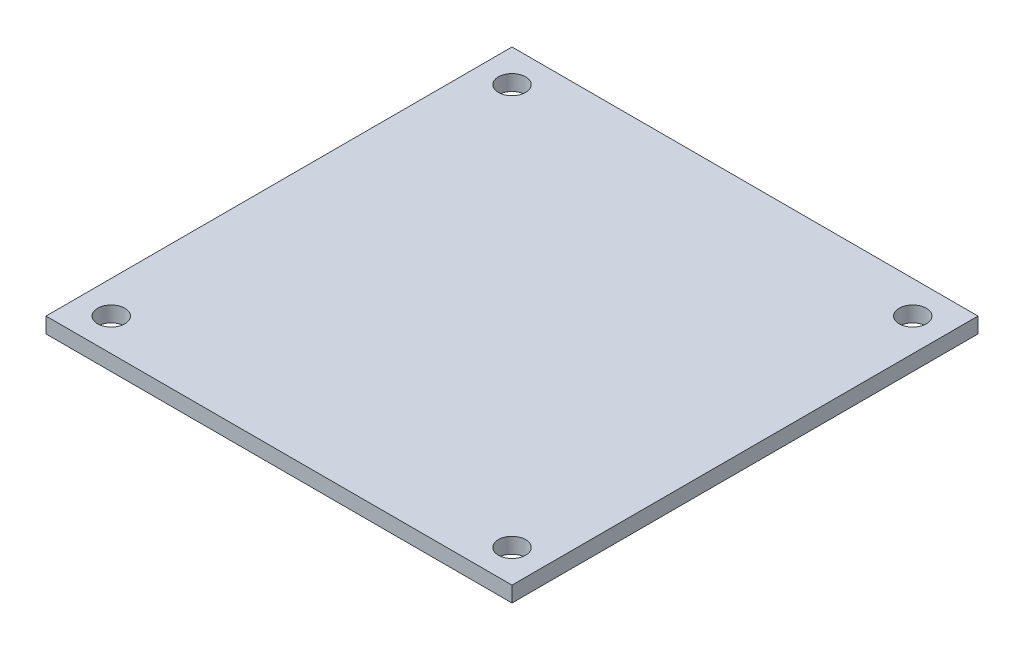
ISO-10303-21;
HEADER;
FILE_DESCRIPTION(('STEP AP214'),'2;1');
FILE_NAME('part.step','',(''),(''),'','','');
FILE_SCHEMA(('AUTOMOTIVE_DESIGN { 1 0 10303 214 1 1 1 1 }'));
ENDSEC;
DATA;
#1=APPLICATION_CONTEXT('core data for automotive mechanical design processes');
#2=APPLICATION_PROTOCOL_DEFINITION('international standard','automotive_design',2000,#1);
#3=PRODUCT_CONTEXT('',#1,'mechanical');
#4=PRODUCT('Part','Part','',(#3));
#5=PRODUCT_RELATED_PRODUCT_CATEGORY('part','',(#4));
#6=PRODUCT_DEFINITION_FORMATION('','',#4);
#7=PRODUCT_DEFINITION_CONTEXT('part definition',#1,'design');
#8=PRODUCT_DEFINITION('design','',#6,#7);
#9=PRODUCT_DEFINITION_SHAPE('','',#8);
#10=(LENGTH_UNIT() NAMED_UNIT(*) SI_UNIT(.MILLI.,.METRE.));
#11=(NAMED_UNIT(*) PLANE_ANGLE_UNIT() SI_UNIT($,.RADIAN.));
#12=(NAMED_UNIT(*) SI_UNIT($,.STERADIAN.) SOLID_ANGLE_UNIT());
#13=UNCERTAINTY_MEASURE_WITH_UNIT(LENGTH_MEASURE(1.E-05),#10,'distance_accuracy_value','');
#14=(GEOMETRIC_REPRESENTATION_CONTEXT(3) GLOBAL_UNCERTAINTY_ASSIGNED_CONTEXT((#13)) GLOBAL_UNIT_ASSIGNED_CONTEXT((#10,
#11,#12)) REPRESENTATION_CONTEXT('',''));
#15=CARTESIAN_POINT('',(0.,0.,0.));
#16=DIRECTION('',(0.,0.,1.));
#17=DIRECTION('',(1.,0.,0.));
#18=AXIS2_PLACEMENT_3D('',#15,#16,#17);
#19=CARTESIAN_POINT('',(30.,2.,30.));
#20=DIRECTION('',(-1.,0.,0.));
#21=DIRECTION('',(0.,0.,1.));
#22=AXIS2_PLACEMENT_3D('',#19,#20,#21);
#23=PLANE('',#22);
#24=DIRECTION('',(0.,0.,-1.));
#25=VECTOR('',#24,1.);
#26=CARTESIAN_POINT('',(30.,0.,30.));
#27=LINE('',#26,#25);
#28=CARTESIAN_POINT('',(30.,0.,30.));
#29=VERTEX_POINT('',#28);
#30=CARTESIAN_POINT('',(30.,0.,-30.));
#31=VERTEX_POINT('',#30);
#32=EDGE_CURVE('E98',#29,#31,#27,.T.);
#33=ORIENTED_EDGE('',*,*,#32,.T.);
#34=DIRECTION('',(0.,-1.,0.));
#35=VECTOR('',#34,1.);
#36=CARTESIAN_POINT('',(30.,2.,-30.));
#37=LINE('',#36,#35);
#38=CARTESIAN_POINT('',(30.,2.,-30.));
#39=VERTEX_POINT('',#38);
#40=EDGE_CURVE('E11',#39,#31,#37,.T.);
#41=ORIENTED_EDGE('',*,*,#40,.F.);
#42=DIRECTION('',(0.,0.,-1.));
#43=VECTOR('',#42,1.);
#44=CARTESIAN_POINT('',(30.,2.,30.));
#45=LINE('',#44,#43);
#46=CARTESIAN_POINT('',(30.,2.,30.));
#47=VERTEX_POINT('',#46);
#48=EDGE_CURVE('E86',#47,#39,#45,.T.);
#49=ORIENTED_EDGE('',*,*,#48,.F.);
#50=DIRECTION('',(0.,-1.,0.));
#51=VECTOR('',#50,1.);
#52=CARTESIAN_POINT('',(30.,2.,30.));
#53=LINE('',#52,#51);
#54=EDGE_CURVE('E94',#47,#29,#53,.T.);
#55=ORIENTED_EDGE('',*,*,#54,.T.);
#56=EDGE_LOOP('',(#33,#41,#49,#55));
#57=FACE_BOUND('',#56,.T.);
#58=ADVANCED_FACE('F35',(#57),#23,.F.);
#59=CARTESIAN_POINT('',(-30.,2.,-30.));
#60=DIRECTION('',(0.,0.,1.));
#61=DIRECTION('',(1.,0.,0.));
#62=AXIS2_PLACEMENT_3D('',#59,#60,#61);
#63=PLANE('',#62);
#64=DIRECTION('',(-1.,0.,0.));
#65=VECTOR('',#64,1.);
#66=CARTESIAN_POINT('',(-30.,0.,-30.));
#67=LINE('',#66,#65);
#68=CARTESIAN_POINT('',(-30.,0.,-30.));
#69=VERTEX_POINT('',#68);
#70=EDGE_CURVE('E90',#31,#69,#67,.T.);
#71=ORIENTED_EDGE('',*,*,#70,.T.);
#72=DIRECTION('',(0.,-1.,0.));
#73=VECTOR('',#72,1.);
#74=CARTESIAN_POINT('',(-30.,2.,-30.));
#75=LINE('',#74,#73);
#76=CARTESIAN_POINT('',(-30.,2.,-30.));
#77=VERTEX_POINT('',#76);
#78=EDGE_CURVE('E43',#77,#69,#75,.T.);
#79=ORIENTED_EDGE('',*,*,#78,.F.);
#80=DIRECTION('',(-1.,0.,0.));
#81=VECTOR('',#80,1.);
#82=CARTESIAN_POINT('',(-30.,2.,-30.));
#83=LINE('',#82,#81);
#84=EDGE_CURVE('E81',#39,#77,#83,.T.);
#85=ORIENTED_EDGE('',*,*,#84,.F.);
#86=ORIENTED_EDGE('',*,*,#40,.T.);
#87=EDGE_LOOP('',(#71,#79,#85,#86));
#88=FACE_BOUND('',#87,.T.);
#89=ADVANCED_FACE('F89',(#88),#63,.F.);
#90=CARTESIAN_POINT('',(-30.,2.,30.));
#91=DIRECTION('',(1.,0.,0.));
#92=DIRECTION('',(0.,0.,-1.));
#93=AXIS2_PLACEMENT_3D('',#90,#91,#92);
#94=PLANE('',#93);
#95=DIRECTION('',(0.,0.,1.));
#96=VECTOR('',#95,1.);
#97=CARTESIAN_POINT('',(-30.,0.,30.));
#98=LINE('',#97,#96);
#99=CARTESIAN_POINT('',(-30.,0.,30.));
#100=VERTEX_POINT('',#99);
#101=EDGE_CURVE('E68',#69,#100,#98,.T.);
#102=ORIENTED_EDGE('',*,*,#101,.T.);
#103=DIRECTION('',(0.,-1.,0.));
#104=VECTOR('',#103,1.);
#105=CARTESIAN_POINT('',(-30.,2.,30.));
#106=LINE('',#105,#104);
#107=CARTESIAN_POINT('',(-30.,2.,30.));
#108=VERTEX_POINT('',#107);
#109=EDGE_CURVE('E91',#108,#100,#106,.T.);
#110=ORIENTED_EDGE('',*,*,#109,.F.);
#111=DIRECTION('',(0.,0.,1.));
#112=VECTOR('',#111,1.);
#113=CARTESIAN_POINT('',(-30.,2.,30.));
#114=LINE('',#113,#112);
#115=EDGE_CURVE('E84',#77,#108,#114,.T.);
#116=ORIENTED_EDGE('',*,*,#115,.F.);
#117=ORIENTED_EDGE('',*,*,#78,.T.);
#118=EDGE_LOOP('',(#102,#110,#116,#117));
#119=FACE_BOUND('',#118,.T.);
#120=ADVANCED_FACE('F92',(#119),#94,.F.);
#121=CARTESIAN_POINT('',(-30.,2.,30.));
#122=DIRECTION('',(0.,0.,-1.));
#123=DIRECTION('',(-1.,0.,0.));
#124=AXIS2_PLACEMENT_3D('',#121,#122,#123);
#125=PLANE('',#124);
#126=DIRECTION('',(1.,0.,0.));
#127=VECTOR('',#126,1.);
#128=CARTESIAN_POINT('',(-30.,0.,30.));
#129=LINE('',#128,#127);
#130=EDGE_CURVE('E74',#100,#29,#129,.T.);
#131=ORIENTED_EDGE('',*,*,#130,.T.);
#132=ORIENTED_EDGE('',*,*,#54,.F.);
#133=DIRECTION('',(1.,0.,0.));
#134=VECTOR('',#133,1.);
#135=CARTESIAN_POINT('',(-30.,2.,30.));
#136=LINE('',#135,#134);
#137=EDGE_CURVE('E51',#108,#47,#136,.T.);
#138=ORIENTED_EDGE('',*,*,#137,.F.);
#139=ORIENTED_EDGE('',*,*,#109,.T.);
#140=EDGE_LOOP('',(#131,#132,#138,#139));
#141=FACE_BOUND('',#140,.T.);
#142=ADVANCED_FACE('F106',(#141),#125,.F.);
#143=CARTESIAN_POINT('',(0.,2.,0.));
#144=DIRECTION('',(0.,-1.,0.));
#145=DIRECTION('',(0.,0.,-1.));
#146=AXIS2_PLACEMENT_3D('',#143,#144,#145);
#147=PLANE('',#146);
#148=CARTESIAN_POINT('',(-25.8,2.,-25.8));
#149=DIRECTION('',(0.,-1.,0.));
#150=DIRECTION('',(0.,0.,1.));
#151=AXIS2_PLACEMENT_3D('',#148,#149,#150);
#152=CIRCLE('',#151,1.75);
#153=CARTESIAN_POINT('',(-25.8,2.,-24.05));
#154=VERTEX_POINT('',#153);
#155=EDGE_CURVE('E121',#154,#154,#152,.T.);
#156=ORIENTED_EDGE('',*,*,#155,.T.);
#157=EDGE_LOOP('',(#156));
#158=FACE_BOUND('',#157,.T.);
#159=CARTESIAN_POINT('',(25.8,2.,-25.8));
#160=DIRECTION('',(0.,-1.,0.));
#161=DIRECTION('',(0.,0.,-1.));
#162=AXIS2_PLACEMENT_3D('',#159,#160,#161);
#163=CIRCLE('',#162,1.75);
#164=CARTESIAN_POINT('',(25.8,2.,-27.55));
#165=VERTEX_POINT('',#164);
#166=EDGE_CURVE('E127',#165,#165,#163,.T.);
#167=ORIENTED_EDGE('',*,*,#166,.T.);
#168=EDGE_LOOP('',(#167));
#169=FACE_BOUND('',#168,.T.);
#170=CARTESIAN_POINT('',(25.8,2.,25.8));
#171=DIRECTION('',(0.,-1.,0.));
#172=DIRECTION('',(0.,0.,1.));
#173=AXIS2_PLACEMENT_3D('',#170,#171,#172);
#174=CIRCLE('',#173,1.75);
#175=CARTESIAN_POINT('',(25.8,2.,27.55));
#176=VERTEX_POINT('',#175);
#177=EDGE_CURVE('E115',#176,#176,#174,.T.);
#178=ORIENTED_EDGE('',*,*,#177,.T.);
#179=EDGE_LOOP('',(#178));
#180=FACE_BOUND('',#179,.T.);
#181=CARTESIAN_POINT('',(-25.8,2.,25.8));
#182=DIRECTION('',(0.,-1.,0.));
#183=DIRECTION('',(0.,0.,-1.));
#184=AXIS2_PLACEMENT_3D('',#181,#182,#183);
#185=CIRCLE('',#184,1.75);
#186=CARTESIAN_POINT('',(-25.8,2.,24.05));
#187=VERTEX_POINT('',#186);
#188=EDGE_CURVE('E101',#187,#187,#185,.T.);
#189=ORIENTED_EDGE('',*,*,#188,.T.);
#190=EDGE_LOOP('',(#189));
#191=FACE_BOUND('',#190,.T.);
#192=ORIENTED_EDGE('',*,*,#48,.T.);
#193=ORIENTED_EDGE('',*,*,#84,.T.);
#194=ORIENTED_EDGE('',*,*,#115,.T.);
#195=ORIENTED_EDGE('',*,*,#137,.T.);
#196=EDGE_LOOP('',(#192,#193,#194,#195));
#197=FACE_BOUND('',#196,.T.);
#198=ADVANCED_FACE('F82',(#158,#169,#180,#191,#197),#147,.F.);
#199=CARTESIAN_POINT('',(0.,0.,0.));
#200=DIRECTION('',(0.,-1.,0.));
#201=DIRECTION('',(0.,0.,-1.));
#202=AXIS2_PLACEMENT_3D('',#199,#200,#201);
#203=PLANE('',#202);
#204=CARTESIAN_POINT('',(-25.8,0.,-25.8));
#205=DIRECTION('',(0.,-1.,0.));
#206=DIRECTION('',(0.,0.,1.));
#207=AXIS2_PLACEMENT_3D('',#204,#205,#206);
#208=CIRCLE('',#207,1.75);
#209=CARTESIAN_POINT('',(-25.8,0.,-24.05));
#210=VERTEX_POINT('',#209);
#211=EDGE_CURVE('E118',#210,#210,#208,.T.);
#212=ORIENTED_EDGE('',*,*,#211,.F.);
#213=EDGE_LOOP('',(#212));
#214=FACE_BOUND('',#213,.T.);
#215=CARTESIAN_POINT('',(25.8,0.,-25.8));
#216=DIRECTION('',(0.,-1.,0.));
#217=DIRECTION('',(0.,0.,-1.));
#218=AXIS2_PLACEMENT_3D('',#215,#216,#217);
#219=CIRCLE('',#218,1.75);
#220=CARTESIAN_POINT('',(25.8,0.,-27.55));
#221=VERTEX_POINT('',#220);
#222=EDGE_CURVE('E124',#221,#221,#219,.T.);
#223=ORIENTED_EDGE('',*,*,#222,.F.);
#224=EDGE_LOOP('',(#223));
#225=FACE_BOUND('',#224,.T.);
#226=CARTESIAN_POINT('',(25.8,0.,25.8));
#227=DIRECTION('',(0.,-1.,0.));
#228=DIRECTION('',(0.,0.,1.));
#229=AXIS2_PLACEMENT_3D('',#226,#227,#228);
#230=CIRCLE('',#229,1.75);
#231=CARTESIAN_POINT('',(25.8,0.,27.55));
#232=VERTEX_POINT('',#231);
#233=EDGE_CURVE('E130',#232,#232,#230,.T.);
#234=ORIENTED_EDGE('',*,*,#233,.F.);
#235=EDGE_LOOP('',(#234));
#236=FACE_BOUND('',#235,.T.);
#237=CARTESIAN_POINT('',(-25.8,0.,25.8));
#238=DIRECTION('',(0.,-1.,0.));
#239=DIRECTION('',(0.,0.,-1.));
#240=AXIS2_PLACEMENT_3D('',#237,#238,#239);
#241=CIRCLE('',#240,1.75);
#242=CARTESIAN_POINT('',(-25.8,0.,24.05));
#243=VERTEX_POINT('',#242);
#244=EDGE_CURVE('E112',#243,#243,#241,.T.);
#245=ORIENTED_EDGE('',*,*,#244,.F.);
#246=EDGE_LOOP('',(#245));
#247=FACE_BOUND('',#246,.T.);
#248=ORIENTED_EDGE('',*,*,#32,.F.);
#249=ORIENTED_EDGE('',*,*,#130,.F.);
#250=ORIENTED_EDGE('',*,*,#101,.F.);
#251=ORIENTED_EDGE('',*,*,#70,.F.);
#252=EDGE_LOOP('',(#248,#249,#250,#251));
#253=FACE_BOUND('',#252,.T.);
#254=ADVANCED_FACE('F109',(#214,#225,#236,#247,#253),#203,.T.);
#255=CARTESIAN_POINT('',(-25.8,2.,25.8));
#256=DIRECTION('',(0.,-1.,0.));
#257=DIRECTION('',(0.,0.,-1.));
#258=AXIS2_PLACEMENT_3D('',#255,#256,#257);
#259=CYLINDRICAL_SURFACE('',#258,1.75);
#260=ORIENTED_EDGE('',*,*,#188,.F.);
#261=EDGE_LOOP('',(#260));
#262=FACE_BOUND('',#261,.T.);
#263=ORIENTED_EDGE('',*,*,#244,.T.);
#264=EDGE_LOOP('',(#263));
#265=FACE_BOUND('',#264,.T.);
#266=ADVANCED_FACE('F142',(#262,#265),#259,.F.);
#267=CARTESIAN_POINT('',(25.8,2.,25.8));
#268=DIRECTION('',(0.,-1.,0.));
#269=DIRECTION('',(0.,0.,-1.));
#270=AXIS2_PLACEMENT_3D('',#267,#268,#269);
#271=CYLINDRICAL_SURFACE('',#270,1.75);
#272=ORIENTED_EDGE('',*,*,#177,.F.);
#273=EDGE_LOOP('',(#272));
#274=FACE_BOUND('',#273,.T.);
#275=ORIENTED_EDGE('',*,*,#233,.T.);
#276=EDGE_LOOP('',(#275));
#277=FACE_BOUND('',#276,.T.);
#278=ADVANCED_FACE('F138',(#274,#277),#271,.F.);
#279=CARTESIAN_POINT('',(25.8,2.,-25.8));
#280=DIRECTION('',(0.,-1.,0.));
#281=DIRECTION('',(0.,0.,-1.));
#282=AXIS2_PLACEMENT_3D('',#279,#280,#281);
#283=CYLINDRICAL_SURFACE('',#282,1.75);
#284=ORIENTED_EDGE('',*,*,#166,.F.);
#285=EDGE_LOOP('',(#284));
#286=FACE_BOUND('',#285,.T.);
#287=ORIENTED_EDGE('',*,*,#222,.T.);
#288=EDGE_LOOP('',(#287));
#289=FACE_BOUND('',#288,.T.);
#290=ADVANCED_FACE('F141',(#286,#289),#283,.F.);
#291=CARTESIAN_POINT('',(-25.8,2.,-25.8));
#292=DIRECTION('',(0.,-1.,0.));
#293=DIRECTION('',(0.,0.,-1.));
#294=AXIS2_PLACEMENT_3D('',#291,#292,#293);
#295=CYLINDRICAL_SURFACE('',#294,1.75);
#296=ORIENTED_EDGE('',*,*,#155,.F.);
#297=EDGE_LOOP('',(#296));
#298=FACE_BOUND('',#297,.T.);
#299=ORIENTED_EDGE('',*,*,#211,.T.);
#300=EDGE_LOOP('',(#299));
#301=FACE_BOUND('',#300,.T.);
#302=ADVANCED_FACE('F180',(#298,#301),#295,.F.);
#303=CLOSED_SHELL('',(#58,#89,#120,#142,#198,#254,#266,#278,#290,#302));
#304=MANIFOLD_SOLID_BREP('B2',#303);
#305=ADVANCED_BREP_SHAPE_REPRESENTATION('',(#18,#304),#14);
#306=SHAPE_DEFINITION_REPRESENTATION(#9,#305);
ENDSEC;
END-ISO-10303-21;
